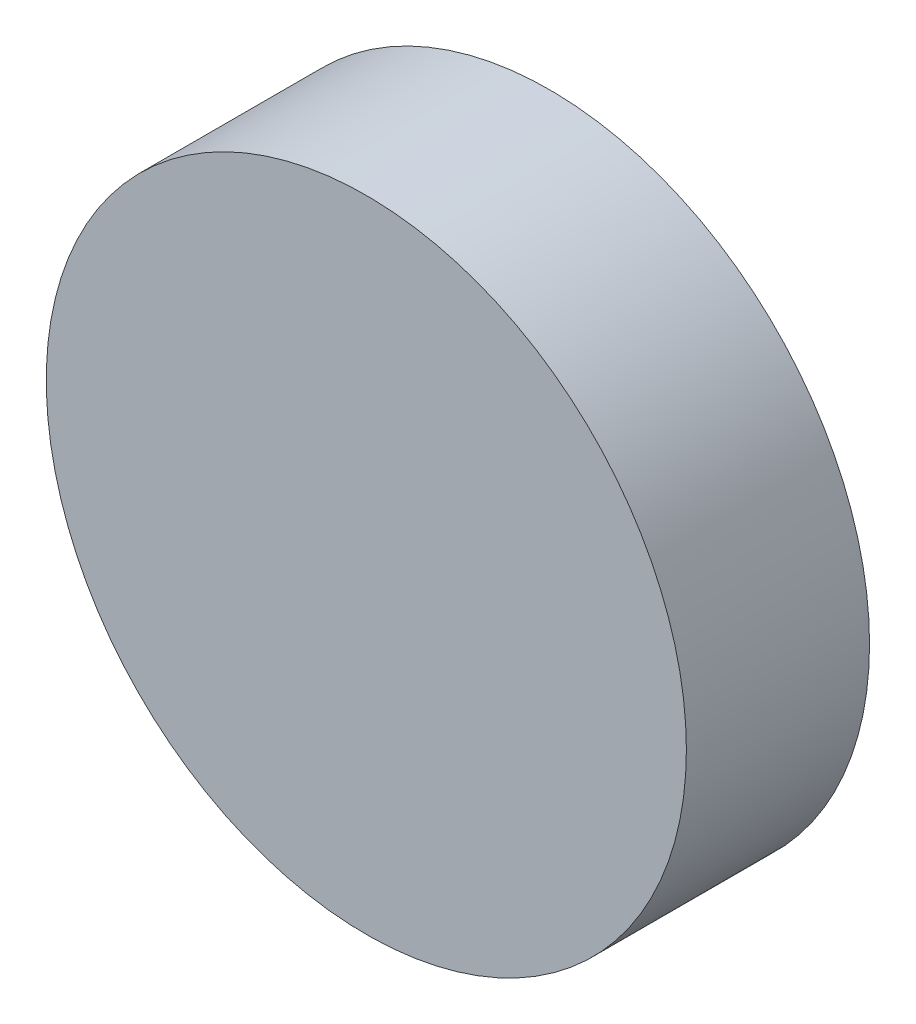
ISO-10303-21;
HEADER;
FILE_DESCRIPTION(('STEP AP214'),'2;1');
FILE_NAME('part.step','',(''),(''),'','','');
FILE_SCHEMA(('AUTOMOTIVE_DESIGN { 1 0 10303 214 1 1 1 1 }'));
ENDSEC;
DATA;
#1=APPLICATION_CONTEXT('core data for automotive mechanical design processes');
#2=APPLICATION_PROTOCOL_DEFINITION('international standard','automotive_design',2000,#1);
#3=PRODUCT_CONTEXT('',#1,'mechanical');
#4=PRODUCT('Part','Part','',(#3));
#5=PRODUCT_RELATED_PRODUCT_CATEGORY('part','',(#4));
#6=PRODUCT_DEFINITION_FORMATION('','',#4);
#7=PRODUCT_DEFINITION_CONTEXT('part definition',#1,'design');
#8=PRODUCT_DEFINITION('design','',#6,#7);
#9=PRODUCT_DEFINITION_SHAPE('','',#8);
#10=(LENGTH_UNIT() NAMED_UNIT(*) SI_UNIT(.MILLI.,.METRE.));
#11=(NAMED_UNIT(*) PLANE_ANGLE_UNIT() SI_UNIT($,.RADIAN.));
#12=(NAMED_UNIT(*) SI_UNIT($,.STERADIAN.) SOLID_ANGLE_UNIT());
#13=UNCERTAINTY_MEASURE_WITH_UNIT(LENGTH_MEASURE(1.E-05),#10,'distance_accuracy_value','');
#14=(GEOMETRIC_REPRESENTATION_CONTEXT(3) GLOBAL_UNCERTAINTY_ASSIGNED_CONTEXT((#13)) GLOBAL_UNIT_ASSIGNED_CONTEXT((#10,
#11,#12)) REPRESENTATION_CONTEXT('',''));
#15=CARTESIAN_POINT('',(0.,0.,0.));
#16=DIRECTION('',(0.,0.,1.));
#17=DIRECTION('',(1.,0.,0.));
#18=AXIS2_PLACEMENT_3D('',#15,#16,#17);
#19=CARTESIAN_POINT('',(0.,0.,6.13144355422355));
#20=DIRECTION('',(0.,0.,-1.));
#21=DIRECTION('',(-1.,0.,0.));
#22=AXIS2_PLACEMENT_3D('',#19,#20,#21);
#23=CYLINDRICAL_SURFACE('',#22,10.7144599439562);
#24=CARTESIAN_POINT('',(0.,0.,6.13144355422355));
#25=DIRECTION('',(0.,0.,1.));
#26=DIRECTION('',(1.,0.,0.));
#27=AXIS2_PLACEMENT_3D('',#24,#25,#26);
#28=CIRCLE('',#27,10.7144599439562);
#29=CARTESIAN_POINT('',(10.7144599439562,0.,6.13144355422355));
#30=VERTEX_POINT('',#29);
#31=EDGE_CURVE('E10',#30,#30,#28,.T.);
#32=ORIENTED_EDGE('',*,*,#31,.F.);
#33=EDGE_LOOP('',(#32));
#34=FACE_BOUND('',#33,.T.);
#35=CARTESIAN_POINT('',(0.,0.,0.));
#36=DIRECTION('',(0.,0.,1.));
#37=DIRECTION('',(1.,0.,0.));
#38=AXIS2_PLACEMENT_3D('',#35,#36,#37);
#39=CIRCLE('',#38,10.7144599439562);
#40=CARTESIAN_POINT('',(10.7144599439562,0.,0.));
#41=VERTEX_POINT('',#40);
#42=EDGE_CURVE('E38',#41,#41,#39,.T.);
#43=ORIENTED_EDGE('',*,*,#42,.T.);
#44=EDGE_LOOP('',(#43));
#45=FACE_BOUND('',#44,.T.);
#46=ADVANCED_FACE('F35',(#34,#45),#23,.T.);
#47=CARTESIAN_POINT('',(0.,0.,6.13144355422355));
#48=DIRECTION('',(0.,0.,1.));
#49=DIRECTION('',(1.,0.,0.));
#50=AXIS2_PLACEMENT_3D('',#47,#48,#49);
#51=PLANE('',#50);
#52=ORIENTED_EDGE('',*,*,#31,.T.);
#53=EDGE_LOOP('',(#52));
#54=FACE_BOUND('',#53,.T.);
#55=ADVANCED_FACE('F50',(#54),#51,.T.);
#56=CARTESIAN_POINT('',(0.,0.,0.));
#57=DIRECTION('',(0.,0.,1.));
#58=DIRECTION('',(1.,0.,0.));
#59=AXIS2_PLACEMENT_3D('',#56,#57,#58);
#60=PLANE('',#59);
#61=ORIENTED_EDGE('',*,*,#42,.F.);
#62=EDGE_LOOP('',(#61));
#63=FACE_BOUND('',#62,.T.);
#64=ADVANCED_FACE('F48',(#63),#60,.F.);
#65=CLOSED_SHELL('',(#46,#55,#64));
#66=MANIFOLD_SOLID_BREP('B2',#65);
#67=ADVANCED_BREP_SHAPE_REPRESENTATION('',(#18,#66),#14);
#68=SHAPE_DEFINITION_REPRESENTATION(#9,#67);
ENDSEC;
END-ISO-10303-21;
